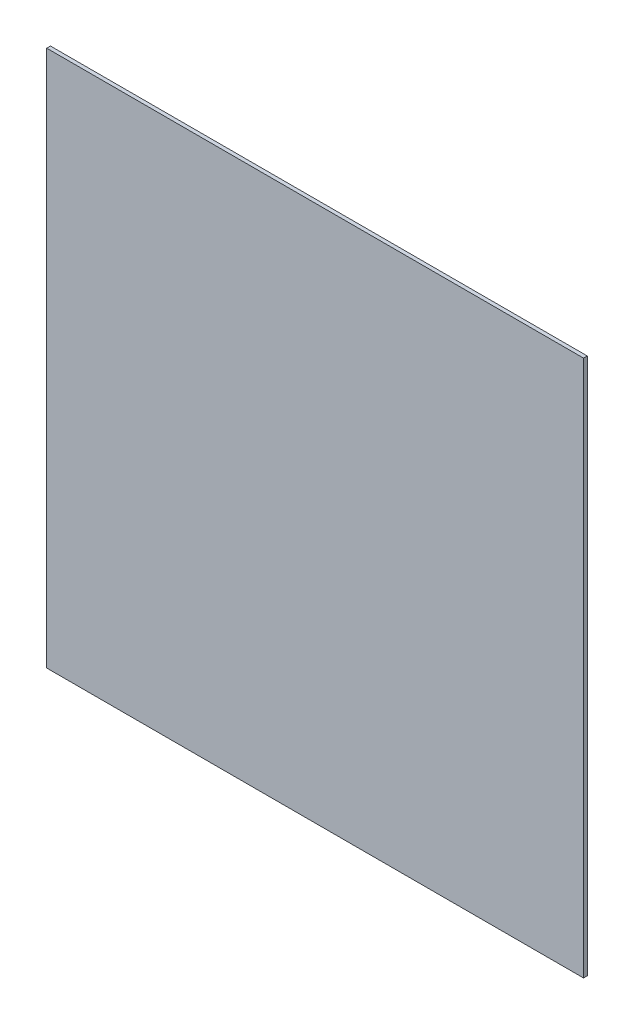
ISO-10303-21;
HEADER;
FILE_DESCRIPTION(('STEP AP214'),'2;1');
FILE_NAME('part.step','',(''),(''),'','','');
FILE_SCHEMA(('AUTOMOTIVE_DESIGN { 1 0 10303 214 1 1 1 1 }'));
ENDSEC;
DATA;
#1=APPLICATION_CONTEXT('core data for automotive mechanical design processes');
#2=APPLICATION_PROTOCOL_DEFINITION('international standard','automotive_design',2000,#1);
#3=PRODUCT_CONTEXT('',#1,'mechanical');
#4=PRODUCT('Part','Part','',(#3));
#5=PRODUCT_RELATED_PRODUCT_CATEGORY('part','',(#4));
#6=PRODUCT_DEFINITION_FORMATION('','',#4);
#7=PRODUCT_DEFINITION_CONTEXT('part definition',#1,'design');
#8=PRODUCT_DEFINITION('design','',#6,#7);
#9=PRODUCT_DEFINITION_SHAPE('','',#8);
#10=(LENGTH_UNIT() NAMED_UNIT(*) SI_UNIT(.MILLI.,.METRE.));
#11=(NAMED_UNIT(*) PLANE_ANGLE_UNIT() SI_UNIT($,.RADIAN.));
#12=(NAMED_UNIT(*) SI_UNIT($,.STERADIAN.) SOLID_ANGLE_UNIT());
#13=UNCERTAINTY_MEASURE_WITH_UNIT(LENGTH_MEASURE(1.E-05),#10,'distance_accuracy_value','');
#14=(GEOMETRIC_REPRESENTATION_CONTEXT(3) GLOBAL_UNCERTAINTY_ASSIGNED_CONTEXT((#13)) GLOBAL_UNIT_ASSIGNED_CONTEXT((#10,
#11,#12)) REPRESENTATION_CONTEXT('',''));
#15=CARTESIAN_POINT('',(0.,0.,0.));
#16=DIRECTION('',(0.,0.,1.));
#17=DIRECTION('',(1.,0.,0.));
#18=AXIS2_PLACEMENT_3D('',#15,#16,#17);
#19=CARTESIAN_POINT('',(12.7,12.7,0.1778));
#20=DIRECTION('',(-1.,0.,0.));
#21=DIRECTION('',(0.,0.,1.));
#22=AXIS2_PLACEMENT_3D('',#19,#20,#21);
#23=PLANE('',#22);
#24=DIRECTION('',(0.,1.,0.));
#25=VECTOR('',#24,1.);
#26=CARTESIAN_POINT('',(12.7,12.7,0.));
#27=LINE('',#26,#25);
#28=CARTESIAN_POINT('',(12.7,-12.7,0.));
#29=VERTEX_POINT('',#28);
#30=CARTESIAN_POINT('',(12.7,12.7,0.));
#31=VERTEX_POINT('',#30);
#32=EDGE_CURVE('E96',#29,#31,#27,.T.);
#33=ORIENTED_EDGE('',*,*,#32,.T.);
#34=DIRECTION('',(0.,0.,-1.));
#35=VECTOR('',#34,1.);
#36=CARTESIAN_POINT('',(12.7,12.7,0.1778));
#37=LINE('',#36,#35);
#38=CARTESIAN_POINT('',(12.7,12.7,0.1778));
#39=VERTEX_POINT('',#38);
#40=EDGE_CURVE('E11',#39,#31,#37,.T.);
#41=ORIENTED_EDGE('',*,*,#40,.F.);
#42=DIRECTION('',(0.,1.,0.));
#43=VECTOR('',#42,1.);
#44=CARTESIAN_POINT('',(12.7,12.7,0.1778));
#45=LINE('',#44,#43);
#46=CARTESIAN_POINT('',(12.7,-12.7,0.1778));
#47=VERTEX_POINT('',#46);
#48=EDGE_CURVE('E84',#47,#39,#45,.T.);
#49=ORIENTED_EDGE('',*,*,#48,.F.);
#50=DIRECTION('',(0.,0.,-1.));
#51=VECTOR('',#50,1.);
#52=CARTESIAN_POINT('',(12.7,-12.7,0.1778));
#53=LINE('',#52,#51);
#54=EDGE_CURVE('E92',#47,#29,#53,.T.);
#55=ORIENTED_EDGE('',*,*,#54,.T.);
#56=EDGE_LOOP('',(#33,#41,#49,#55));
#57=FACE_BOUND('',#56,.T.);
#58=ADVANCED_FACE('F33',(#57),#23,.F.);
#59=CARTESIAN_POINT('',(-12.7,12.7,0.1778));
#60=DIRECTION('',(0.,-1.,0.));
#61=DIRECTION('',(0.,0.,-1.));
#62=AXIS2_PLACEMENT_3D('',#59,#60,#61);
#63=PLANE('',#62);
#64=DIRECTION('',(-1.,0.,0.));
#65=VECTOR('',#64,1.);
#66=CARTESIAN_POINT('',(-12.7,12.7,0.));
#67=LINE('',#66,#65);
#68=CARTESIAN_POINT('',(-12.7,12.7,0.));
#69=VERTEX_POINT('',#68);
#70=EDGE_CURVE('E88',#31,#69,#67,.T.);
#71=ORIENTED_EDGE('',*,*,#70,.T.);
#72=DIRECTION('',(0.,0.,-1.));
#73=VECTOR('',#72,1.);
#74=CARTESIAN_POINT('',(-12.7,12.7,0.1778));
#75=LINE('',#74,#73);
#76=CARTESIAN_POINT('',(-12.7,12.7,0.1778));
#77=VERTEX_POINT('',#76);
#78=EDGE_CURVE('E41',#77,#69,#75,.T.);
#79=ORIENTED_EDGE('',*,*,#78,.F.);
#80=DIRECTION('',(-1.,0.,0.));
#81=VECTOR('',#80,1.);
#82=CARTESIAN_POINT('',(-12.7,12.7,0.1778));
#83=LINE('',#82,#81);
#84=EDGE_CURVE('E79',#39,#77,#83,.T.);
#85=ORIENTED_EDGE('',*,*,#84,.F.);
#86=ORIENTED_EDGE('',*,*,#40,.T.);
#87=EDGE_LOOP('',(#71,#79,#85,#86));
#88=FACE_BOUND('',#87,.T.);
#89=ADVANCED_FACE('F87',(#88),#63,.F.);
#90=CARTESIAN_POINT('',(-12.7,12.7,0.1778));
#91=DIRECTION('',(1.,0.,0.));
#92=DIRECTION('',(0.,1.,0.));
#93=AXIS2_PLACEMENT_3D('',#90,#91,#92);
#94=PLANE('',#93);
#95=DIRECTION('',(0.,-1.,0.));
#96=VECTOR('',#95,1.);
#97=CARTESIAN_POINT('',(-12.7,12.7,0.));
#98=LINE('',#97,#96);
#99=CARTESIAN_POINT('',(-12.7,-12.7,0.));
#100=VERTEX_POINT('',#99);
#101=EDGE_CURVE('E66',#69,#100,#98,.T.);
#102=ORIENTED_EDGE('',*,*,#101,.T.);
#103=DIRECTION('',(0.,0.,-1.));
#104=VECTOR('',#103,1.);
#105=CARTESIAN_POINT('',(-12.7,-12.7,0.1778));
#106=LINE('',#105,#104);
#107=CARTESIAN_POINT('',(-12.7,-12.7,0.1778));
#108=VERTEX_POINT('',#107);
#109=EDGE_CURVE('E89',#108,#100,#106,.T.);
#110=ORIENTED_EDGE('',*,*,#109,.F.);
#111=DIRECTION('',(0.,-1.,0.));
#112=VECTOR('',#111,1.);
#113=CARTESIAN_POINT('',(-12.7,12.7,0.1778));
#114=LINE('',#113,#112);
#115=EDGE_CURVE('E82',#77,#108,#114,.T.);
#116=ORIENTED_EDGE('',*,*,#115,.F.);
#117=ORIENTED_EDGE('',*,*,#78,.T.);
#118=EDGE_LOOP('',(#102,#110,#116,#117));
#119=FACE_BOUND('',#118,.T.);
#120=ADVANCED_FACE('F90',(#119),#94,.F.);
#121=CARTESIAN_POINT('',(-12.7,-12.7,0.1778));
#122=DIRECTION('',(0.,1.,0.));
#123=DIRECTION('',(-1.,0.,0.));
#124=AXIS2_PLACEMENT_3D('',#121,#122,#123);
#125=PLANE('',#124);
#126=DIRECTION('',(1.,0.,0.));
#127=VECTOR('',#126,1.);
#128=CARTESIAN_POINT('',(-12.7,-12.7,0.));
#129=LINE('',#128,#127);
#130=EDGE_CURVE('E72',#100,#29,#129,.T.);
#131=ORIENTED_EDGE('',*,*,#130,.T.);
#132=ORIENTED_EDGE('',*,*,#54,.F.);
#133=DIRECTION('',(1.,0.,0.));
#134=VECTOR('',#133,1.);
#135=CARTESIAN_POINT('',(-12.7,-12.7,0.1778));
#136=LINE('',#135,#134);
#137=EDGE_CURVE('E49',#108,#47,#136,.T.);
#138=ORIENTED_EDGE('',*,*,#137,.F.);
#139=ORIENTED_EDGE('',*,*,#109,.T.);
#140=EDGE_LOOP('',(#131,#132,#138,#139));
#141=FACE_BOUND('',#140,.T.);
#142=ADVANCED_FACE('F103',(#141),#125,.F.);
#143=CARTESIAN_POINT('',(0.,0.,0.1778));
#144=DIRECTION('',(0.,0.,1.));
#145=DIRECTION('',(1.,0.,0.));
#146=AXIS2_PLACEMENT_3D('',#143,#144,#145);
#147=PLANE('',#146);
#148=ORIENTED_EDGE('',*,*,#48,.T.);
#149=ORIENTED_EDGE('',*,*,#84,.T.);
#150=ORIENTED_EDGE('',*,*,#115,.T.);
#151=ORIENTED_EDGE('',*,*,#137,.T.);
#152=EDGE_LOOP('',(#148,#149,#150,#151));
#153=FACE_BOUND('',#152,.T.);
#154=ADVANCED_FACE('F80',(#153),#147,.T.);
#155=CARTESIAN_POINT('',(0.,0.,0.));
#156=DIRECTION('',(0.,0.,1.));
#157=DIRECTION('',(1.,0.,0.));
#158=AXIS2_PLACEMENT_3D('',#155,#156,#157);
#159=PLANE('',#158);
#160=ORIENTED_EDGE('',*,*,#32,.F.);
#161=ORIENTED_EDGE('',*,*,#130,.F.);
#162=ORIENTED_EDGE('',*,*,#101,.F.);
#163=ORIENTED_EDGE('',*,*,#70,.F.);
#164=EDGE_LOOP('',(#160,#161,#162,#163));
#165=FACE_BOUND('',#164,.T.);
#166=ADVANCED_FACE('F106',(#165),#159,.F.);
#167=CLOSED_SHELL('',(#58,#89,#120,#142,#154,#166));
#168=MANIFOLD_SOLID_BREP('B2',#167);
#169=ADVANCED_BREP_SHAPE_REPRESENTATION('',(#18,#168),#14);
#170=SHAPE_DEFINITION_REPRESENTATION(#9,#169);
ENDSEC;
END-ISO-10303-21;
